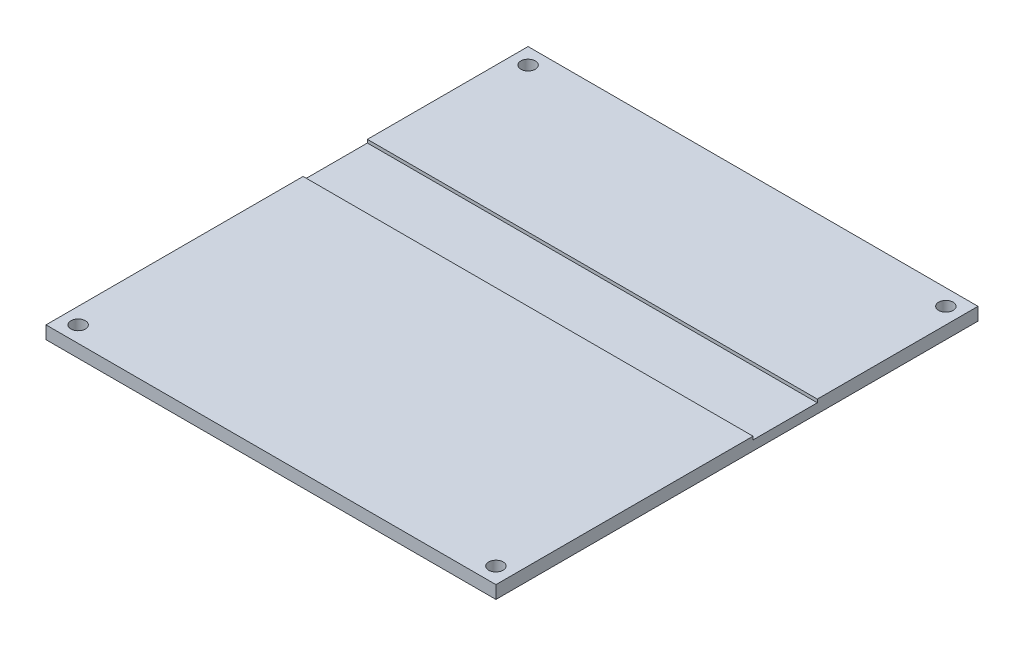
ISO-10303-21;
HEADER;
FILE_DESCRIPTION(('STEP AP214'),'2;1');
FILE_NAME('part.step','',(''),(''),'','','');
FILE_SCHEMA(('AUTOMOTIVE_DESIGN { 1 0 10303 214 1 1 1 1 }'));
ENDSEC;
DATA;
#1=APPLICATION_CONTEXT('core data for automotive mechanical design processes');
#2=APPLICATION_PROTOCOL_DEFINITION('international standard','automotive_design',2000,#1);
#3=PRODUCT_CONTEXT('',#1,'mechanical');
#4=PRODUCT('Part','Part','',(#3));
#5=PRODUCT_RELATED_PRODUCT_CATEGORY('part','',(#4));
#6=PRODUCT_DEFINITION_FORMATION('','',#4);
#7=PRODUCT_DEFINITION_CONTEXT('part definition',#1,'design');
#8=PRODUCT_DEFINITION('design','',#6,#7);
#9=PRODUCT_DEFINITION_SHAPE('','',#8);
#10=(LENGTH_UNIT() NAMED_UNIT(*) SI_UNIT(.MILLI.,.METRE.));
#11=(NAMED_UNIT(*) PLANE_ANGLE_UNIT() SI_UNIT($,.RADIAN.));
#12=(NAMED_UNIT(*) SI_UNIT($,.STERADIAN.) SOLID_ANGLE_UNIT());
#13=UNCERTAINTY_MEASURE_WITH_UNIT(LENGTH_MEASURE(1.E-05),#10,'distance_accuracy_value','');
#14=(GEOMETRIC_REPRESENTATION_CONTEXT(3) GLOBAL_UNCERTAINTY_ASSIGNED_CONTEXT((#13)) GLOBAL_UNIT_ASSIGNED_CONTEXT((#10,
#11,#12)) REPRESENTATION_CONTEXT('',''));
#15=CARTESIAN_POINT('',(0.,0.,0.));
#16=DIRECTION('',(0.,0.,1.));
#17=DIRECTION('',(1.,0.,0.));
#18=AXIS2_PLACEMENT_3D('',#15,#16,#17);
#19=CARTESIAN_POINT('',(0.,4.,0.));
#20=DIRECTION('',(0.,-1.,0.));
#21=DIRECTION('',(0.,0.,-1.));
#22=AXIS2_PLACEMENT_3D('',#19,#20,#21);
#23=PLANE('',#22);
#24=CARTESIAN_POINT('',(-65.,4.,-70.));
#25=DIRECTION('',(0.,1.,0.));
#26=DIRECTION('',(0.,0.,1.));
#27=AXIS2_PLACEMENT_3D('',#24,#25,#26);
#28=CIRCLE('',#27,2.24999999999999);
#29=CARTESIAN_POINT('',(-65.,4.,-67.75));
#30=VERTEX_POINT('',#29);
#31=EDGE_CURVE('E148',#30,#30,#28,.T.);
#32=ORIENTED_EDGE('',*,*,#31,.F.);
#33=EDGE_LOOP('',(#32));
#34=FACE_BOUND('',#33,.T.);
#35=CARTESIAN_POINT('',(65.,4.,-70.));
#36=DIRECTION('',(0.,1.,0.));
#37=DIRECTION('',(0.,0.,1.));
#38=AXIS2_PLACEMENT_3D('',#35,#36,#37);
#39=CIRCLE('',#38,2.24999999999999);
#40=CARTESIAN_POINT('',(65.,4.,-67.75));
#41=VERTEX_POINT('',#40);
#42=EDGE_CURVE('E167',#41,#41,#39,.T.);
#43=ORIENTED_EDGE('',*,*,#42,.F.);
#44=EDGE_LOOP('',(#43));
#45=FACE_BOUND('',#44,.T.);
#46=DIRECTION('',(0.,0.,1.));
#47=VECTOR('',#46,1.);
#48=CARTESIAN_POINT('',(-70.,4.,75.));
#49=LINE('',#48,#47);
#50=CARTESIAN_POINT('',(-70.,4.,-75.));
#51=VERTEX_POINT('',#50);
#52=CARTESIAN_POINT('',(-70.,4.,-25.));
#53=VERTEX_POINT('',#52);
#54=EDGE_CURVE('E178',#51,#53,#49,.T.);
#55=ORIENTED_EDGE('',*,*,#54,.T.);
#56=DIRECTION('',(-1.,0.,0.));
#57=VECTOR('',#56,1.);
#58=CARTESIAN_POINT('',(-70.,4.,-25.));
#59=LINE('',#58,#57);
#60=CARTESIAN_POINT('',(70.,4.,-25.));
#61=VERTEX_POINT('',#60);
#62=EDGE_CURVE('E136',#61,#53,#59,.T.);
#63=ORIENTED_EDGE('',*,*,#62,.F.);
#64=DIRECTION('',(0.,0.,-1.));
#65=VECTOR('',#64,1.);
#66=CARTESIAN_POINT('',(70.,4.,75.));
#67=LINE('',#66,#65);
#68=CARTESIAN_POINT('',(70.,4.,-75.));
#69=VERTEX_POINT('',#68);
#70=EDGE_CURVE('E98',#61,#69,#67,.T.);
#71=ORIENTED_EDGE('',*,*,#70,.T.);
#72=DIRECTION('',(-1.,0.,0.));
#73=VECTOR('',#72,1.);
#74=CARTESIAN_POINT('',(-70.,4.,-75.));
#75=LINE('',#74,#73);
#76=EDGE_CURVE('E176',#69,#51,#75,.T.);
#77=ORIENTED_EDGE('',*,*,#76,.T.);
#78=EDGE_LOOP('',(#55,#63,#71,#77));
#79=FACE_BOUND('',#78,.T.);
#80=ADVANCED_FACE('F45',(#34,#45,#79),#23,.F.);
#81=CARTESIAN_POINT('',(-65.,4.,70.));
#82=DIRECTION('',(0.,1.,0.));
#83=DIRECTION('',(0.,0.,1.));
#84=AXIS2_PLACEMENT_3D('',#81,#82,#83);
#85=CIRCLE('',#84,2.24999999999999);
#86=CARTESIAN_POINT('',(-65.,4.,72.25));
#87=VERTEX_POINT('',#86);
#88=EDGE_CURVE('E161',#87,#87,#85,.T.);
#89=ORIENTED_EDGE('',*,*,#88,.F.);
#90=EDGE_LOOP('',(#89));
#91=FACE_BOUND('',#90,.T.);
#92=CARTESIAN_POINT('',(70.,4.,75.));
#93=VERTEX_POINT('',#92);
#94=CARTESIAN_POINT('',(70.,4.,-4.99999999999999));
#95=VERTEX_POINT('',#94);
#96=EDGE_CURVE('E174',#93,#95,#67,.T.);
#97=ORIENTED_EDGE('',*,*,#96,.T.);
#98=DIRECTION('',(1.,0.,0.));
#99=VECTOR('',#98,1.);
#100=CARTESIAN_POINT('',(-70.,4.,-4.99999999999999));
#101=LINE('',#100,#99);
#102=CARTESIAN_POINT('',(-70.,4.,-4.99999999999999));
#103=VERTEX_POINT('',#102);
#104=EDGE_CURVE('E330',#103,#95,#101,.T.);
#105=ORIENTED_EDGE('',*,*,#104,.F.);
#106=CARTESIAN_POINT('',(-70.,4.,75.));
#107=VERTEX_POINT('',#106);
#108=EDGE_CURVE('E141',#103,#107,#49,.T.);
#109=ORIENTED_EDGE('',*,*,#108,.T.);
#110=DIRECTION('',(1.,0.,0.));
#111=VECTOR('',#110,1.);
#112=CARTESIAN_POINT('',(-70.,4.,75.));
#113=LINE('',#112,#111);
#114=EDGE_CURVE('E69',#107,#93,#113,.T.);
#115=ORIENTED_EDGE('',*,*,#114,.T.);
#116=EDGE_LOOP('',(#97,#105,#109,#115));
#117=FACE_BOUND('',#116,.T.);
#118=CARTESIAN_POINT('',(65.,4.,70.));
#119=DIRECTION('',(0.,1.,0.));
#120=DIRECTION('',(0.,0.,1.));
#121=AXIS2_PLACEMENT_3D('',#118,#119,#120);
#122=CIRCLE('',#121,2.24999999999999);
#123=CARTESIAN_POINT('',(65.,4.,72.25));
#124=VERTEX_POINT('',#123);
#125=EDGE_CURVE('E155',#124,#124,#122,.T.);
#126=ORIENTED_EDGE('',*,*,#125,.F.);
#127=EDGE_LOOP('',(#126));
#128=FACE_BOUND('',#127,.T.);
#129=ADVANCED_FACE('F217',(#91,#117,#128),#23,.F.);
#130=CARTESIAN_POINT('',(70.,4.,75.));
#131=DIRECTION('',(-1.,0.,0.));
#132=DIRECTION('',(0.,0.,1.));
#133=AXIS2_PLACEMENT_3D('',#130,#131,#132);
#134=PLANE('',#133);
#135=ORIENTED_EDGE('',*,*,#70,.F.);
#136=DIRECTION('',(0.,1.,0.));
#137=VECTOR('',#136,1.);
#138=CARTESIAN_POINT('',(70.,3.,-25.));
#139=LINE('',#138,#137);
#140=CARTESIAN_POINT('',(70.,3.,-25.));
#141=VERTEX_POINT('',#140);
#142=EDGE_CURVE('E143',#141,#61,#139,.T.);
#143=ORIENTED_EDGE('',*,*,#142,.F.);
#144=DIRECTION('',(0.,0.,-1.));
#145=VECTOR('',#144,1.);
#146=CARTESIAN_POINT('',(70.,3.,-4.99999999999999));
#147=LINE('',#146,#145);
#148=CARTESIAN_POINT('',(70.,3.,-4.99999999999999));
#149=VERTEX_POINT('',#148);
#150=EDGE_CURVE('E129',#149,#141,#147,.T.);
#151=ORIENTED_EDGE('',*,*,#150,.F.);
#152=DIRECTION('',(0.,1.,0.));
#153=VECTOR('',#152,1.);
#154=CARTESIAN_POINT('',(70.,3.,-4.99999999999999));
#155=LINE('',#154,#153);
#156=EDGE_CURVE('E127',#149,#95,#155,.T.);
#157=ORIENTED_EDGE('',*,*,#156,.T.);
#158=ORIENTED_EDGE('',*,*,#96,.F.);
#159=DIRECTION('',(0.,-1.,0.));
#160=VECTOR('',#159,1.);
#161=CARTESIAN_POINT('',(70.,4.,75.));
#162=LINE('',#161,#160);
#163=CARTESIAN_POINT('',(70.,0.,75.));
#164=VERTEX_POINT('',#163);
#165=EDGE_CURVE('E182',#93,#164,#162,.T.);
#166=ORIENTED_EDGE('',*,*,#165,.T.);
#167=DIRECTION('',(0.,0.,-1.));
#168=VECTOR('',#167,1.);
#169=CARTESIAN_POINT('',(70.,0.,75.));
#170=LINE('',#169,#168);
#171=CARTESIAN_POINT('',(70.,0.,-75.));
#172=VERTEX_POINT('',#171);
#173=EDGE_CURVE('E173',#164,#172,#170,.T.);
#174=ORIENTED_EDGE('',*,*,#173,.T.);
#175=DIRECTION('',(0.,-1.,0.));
#176=VECTOR('',#175,1.);
#177=CARTESIAN_POINT('',(70.,4.,-75.));
#178=LINE('',#177,#176);
#179=EDGE_CURVE('E11',#69,#172,#178,.T.);
#180=ORIENTED_EDGE('',*,*,#179,.F.);
#181=EDGE_LOOP('',(#135,#143,#151,#157,#158,#166,#174,#180));
#182=FACE_BOUND('',#181,.T.);
#183=ADVANCED_FACE('F47',(#182),#134,.F.);
#184=CARTESIAN_POINT('',(-70.,4.,-75.));
#185=DIRECTION('',(0.,0.,1.));
#186=DIRECTION('',(1.,0.,0.));
#187=AXIS2_PLACEMENT_3D('',#184,#185,#186);
#188=PLANE('',#187);
#189=DIRECTION('',(-1.,0.,0.));
#190=VECTOR('',#189,1.);
#191=CARTESIAN_POINT('',(-70.,0.,-75.));
#192=LINE('',#191,#190);
#193=CARTESIAN_POINT('',(-70.,0.,-75.));
#194=VERTEX_POINT('',#193);
#195=EDGE_CURVE('E185',#172,#194,#192,.T.);
#196=ORIENTED_EDGE('',*,*,#195,.T.);
#197=DIRECTION('',(0.,-1.,0.));
#198=VECTOR('',#197,1.);
#199=CARTESIAN_POINT('',(-70.,4.,-75.));
#200=LINE('',#199,#198);
#201=EDGE_CURVE('E53',#51,#194,#200,.T.);
#202=ORIENTED_EDGE('',*,*,#201,.F.);
#203=ORIENTED_EDGE('',*,*,#76,.F.);
#204=ORIENTED_EDGE('',*,*,#179,.T.);
#205=EDGE_LOOP('',(#196,#202,#203,#204));
#206=FACE_BOUND('',#205,.T.);
#207=ADVANCED_FACE('F214',(#206),#188,.F.);
#208=CARTESIAN_POINT('',(-70.,4.,75.));
#209=DIRECTION('',(1.,0.,0.));
#210=DIRECTION('',(0.,0.,-1.));
#211=AXIS2_PLACEMENT_3D('',#208,#209,#210);
#212=PLANE('',#211);
#213=DIRECTION('',(0.,0.,1.));
#214=VECTOR('',#213,1.);
#215=CARTESIAN_POINT('',(-70.,3.,-4.99999999999999));
#216=LINE('',#215,#214);
#217=CARTESIAN_POINT('',(-70.,3.,-25.));
#218=VERTEX_POINT('',#217);
#219=CARTESIAN_POINT('',(-70.,3.,-4.99999999999999));
#220=VERTEX_POINT('',#219);
#221=EDGE_CURVE('E130',#218,#220,#216,.T.);
#222=ORIENTED_EDGE('',*,*,#221,.F.);
#223=DIRECTION('',(0.,1.,0.));
#224=VECTOR('',#223,1.);
#225=CARTESIAN_POINT('',(-70.,3.,-25.));
#226=LINE('',#225,#224);
#227=EDGE_CURVE('E152',#218,#53,#226,.T.);
#228=ORIENTED_EDGE('',*,*,#227,.T.);
#229=ORIENTED_EDGE('',*,*,#54,.F.);
#230=ORIENTED_EDGE('',*,*,#201,.T.);
#231=DIRECTION('',(0.,0.,1.));
#232=VECTOR('',#231,1.);
#233=CARTESIAN_POINT('',(-70.,0.,75.));
#234=LINE('',#233,#232);
#235=CARTESIAN_POINT('',(-70.,0.,75.));
#236=VERTEX_POINT('',#235);
#237=EDGE_CURVE('E187',#194,#236,#234,.T.);
#238=ORIENTED_EDGE('',*,*,#237,.T.);
#239=DIRECTION('',(0.,-1.,0.));
#240=VECTOR('',#239,1.);
#241=CARTESIAN_POINT('',(-70.,4.,75.));
#242=LINE('',#241,#240);
#243=EDGE_CURVE('E191',#107,#236,#242,.T.);
#244=ORIENTED_EDGE('',*,*,#243,.F.);
#245=ORIENTED_EDGE('',*,*,#108,.F.);
#246=DIRECTION('',(0.,1.,0.));
#247=VECTOR('',#246,1.);
#248=CARTESIAN_POINT('',(-70.,3.,-4.99999999999999));
#249=LINE('',#248,#247);
#250=EDGE_CURVE('E124',#220,#103,#249,.T.);
#251=ORIENTED_EDGE('',*,*,#250,.F.);
#252=EDGE_LOOP('',(#222,#228,#229,#230,#238,#244,#245,#251));
#253=FACE_BOUND('',#252,.T.);
#254=ADVANCED_FACE('F139',(#253),#212,.F.);
#255=CARTESIAN_POINT('',(-70.,4.,75.));
#256=DIRECTION('',(0.,0.,-1.));
#257=DIRECTION('',(-1.,0.,0.));
#258=AXIS2_PLACEMENT_3D('',#255,#256,#257);
#259=PLANE('',#258);
#260=DIRECTION('',(1.,0.,0.));
#261=VECTOR('',#260,1.);
#262=CARTESIAN_POINT('',(-70.,0.,75.));
#263=LINE('',#262,#261);
#264=EDGE_CURVE('E90',#236,#164,#263,.T.);
#265=ORIENTED_EDGE('',*,*,#264,.T.);
#266=ORIENTED_EDGE('',*,*,#165,.F.);
#267=ORIENTED_EDGE('',*,*,#114,.F.);
#268=ORIENTED_EDGE('',*,*,#243,.T.);
#269=EDGE_LOOP('',(#265,#266,#267,#268));
#270=FACE_BOUND('',#269,.T.);
#271=ADVANCED_FACE('F203',(#270),#259,.F.);
#272=CARTESIAN_POINT('',(0.,0.,0.));
#273=DIRECTION('',(0.,-1.,0.));
#274=DIRECTION('',(0.,0.,-1.));
#275=AXIS2_PLACEMENT_3D('',#272,#273,#274);
#276=PLANE('',#275);
#277=CARTESIAN_POINT('',(-65.,0.,-70.));
#278=DIRECTION('',(0.,-1.,0.));
#279=DIRECTION('',(0.,0.,-1.));
#280=AXIS2_PLACEMENT_3D('',#277,#278,#279);
#281=CIRCLE('',#280,2.25);
#282=CARTESIAN_POINT('',(-65.,0.,-72.25));
#283=VERTEX_POINT('',#282);
#284=EDGE_CURVE('E151',#283,#283,#281,.T.);
#285=ORIENTED_EDGE('',*,*,#284,.F.);
#286=EDGE_LOOP('',(#285));
#287=FACE_BOUND('',#286,.T.);
#288=CARTESIAN_POINT('',(65.,0.,70.));
#289=DIRECTION('',(0.,-1.,0.));
#290=DIRECTION('',(0.,0.,-1.));
#291=AXIS2_PLACEMENT_3D('',#288,#289,#290);
#292=CIRCLE('',#291,2.25);
#293=CARTESIAN_POINT('',(65.,0.,67.75));
#294=VERTEX_POINT('',#293);
#295=EDGE_CURVE('E158',#294,#294,#292,.T.);
#296=ORIENTED_EDGE('',*,*,#295,.F.);
#297=EDGE_LOOP('',(#296));
#298=FACE_BOUND('',#297,.T.);
#299=CARTESIAN_POINT('',(-65.,0.,70.));
#300=DIRECTION('',(0.,-1.,0.));
#301=DIRECTION('',(0.,0.,-1.));
#302=AXIS2_PLACEMENT_3D('',#299,#300,#301);
#303=CIRCLE('',#302,2.25);
#304=CARTESIAN_POINT('',(-65.,0.,67.75));
#305=VERTEX_POINT('',#304);
#306=EDGE_CURVE('E164',#305,#305,#303,.T.);
#307=ORIENTED_EDGE('',*,*,#306,.F.);
#308=EDGE_LOOP('',(#307));
#309=FACE_BOUND('',#308,.T.);
#310=CARTESIAN_POINT('',(65.,0.,-70.));
#311=DIRECTION('',(0.,-1.,0.));
#312=DIRECTION('',(0.,0.,-1.));
#313=AXIS2_PLACEMENT_3D('',#310,#311,#312);
#314=CIRCLE('',#313,2.25);
#315=CARTESIAN_POINT('',(65.,0.,-72.25));
#316=VERTEX_POINT('',#315);
#317=EDGE_CURVE('E170',#316,#316,#314,.T.);
#318=ORIENTED_EDGE('',*,*,#317,.F.);
#319=EDGE_LOOP('',(#318));
#320=FACE_BOUND('',#319,.T.);
#321=ORIENTED_EDGE('',*,*,#173,.F.);
#322=ORIENTED_EDGE('',*,*,#264,.F.);
#323=ORIENTED_EDGE('',*,*,#237,.F.);
#324=ORIENTED_EDGE('',*,*,#195,.F.);
#325=EDGE_LOOP('',(#321,#322,#323,#324));
#326=FACE_BOUND('',#325,.T.);
#327=ADVANCED_FACE('F199',(#287,#298,#309,#320,#326),#276,.T.);
#328=CARTESIAN_POINT('',(65.,4.,-70.));
#329=DIRECTION('',(0.,1.,0.));
#330=DIRECTION('',(0.,0.,1.));
#331=AXIS2_PLACEMENT_3D('',#328,#329,#330);
#332=CYLINDRICAL_SURFACE('',#331,2.25);
#333=ORIENTED_EDGE('',*,*,#42,.T.);
#334=EDGE_LOOP('',(#333));
#335=FACE_BOUND('',#334,.T.);
#336=ORIENTED_EDGE('',*,*,#317,.T.);
#337=EDGE_LOOP('',(#336));
#338=FACE_BOUND('',#337,.T.);
#339=ADVANCED_FACE('F210',(#335,#338),#332,.F.);
#340=CARTESIAN_POINT('',(-65.,4.,70.));
#341=DIRECTION('',(0.,1.,0.));
#342=DIRECTION('',(0.,0.,1.));
#343=AXIS2_PLACEMENT_3D('',#340,#341,#342);
#344=CYLINDRICAL_SURFACE('',#343,2.25);
#345=ORIENTED_EDGE('',*,*,#88,.T.);
#346=EDGE_LOOP('',(#345));
#347=FACE_BOUND('',#346,.T.);
#348=ORIENTED_EDGE('',*,*,#306,.T.);
#349=EDGE_LOOP('',(#348));
#350=FACE_BOUND('',#349,.T.);
#351=ADVANCED_FACE('F230',(#347,#350),#344,.F.);
#352=CARTESIAN_POINT('',(65.,4.,70.));
#353=DIRECTION('',(0.,1.,0.));
#354=DIRECTION('',(0.,0.,1.));
#355=AXIS2_PLACEMENT_3D('',#352,#353,#354);
#356=CYLINDRICAL_SURFACE('',#355,2.25);
#357=ORIENTED_EDGE('',*,*,#125,.T.);
#358=EDGE_LOOP('',(#357));
#359=FACE_BOUND('',#358,.T.);
#360=ORIENTED_EDGE('',*,*,#295,.T.);
#361=EDGE_LOOP('',(#360));
#362=FACE_BOUND('',#361,.T.);
#363=ADVANCED_FACE('F234',(#359,#362),#356,.F.);
#364=CARTESIAN_POINT('',(-65.,4.,-70.));
#365=DIRECTION('',(0.,1.,0.));
#366=DIRECTION('',(0.,0.,1.));
#367=AXIS2_PLACEMENT_3D('',#364,#365,#366);
#368=CYLINDRICAL_SURFACE('',#367,2.25);
#369=ORIENTED_EDGE('',*,*,#31,.T.);
#370=EDGE_LOOP('',(#369));
#371=FACE_BOUND('',#370,.T.);
#372=ORIENTED_EDGE('',*,*,#284,.T.);
#373=EDGE_LOOP('',(#372));
#374=FACE_BOUND('',#373,.T.);
#375=ADVANCED_FACE('F238',(#371,#374),#368,.F.);
#376=CARTESIAN_POINT('',(-70.,3.,-25.));
#377=DIRECTION('',(0.,0.,-1.));
#378=DIRECTION('',(-1.,0.,0.));
#379=AXIS2_PLACEMENT_3D('',#376,#377,#378);
#380=PLANE('',#379);
#381=ORIENTED_EDGE('',*,*,#62,.T.);
#382=ORIENTED_EDGE('',*,*,#227,.F.);
#383=DIRECTION('',(-1.,0.,0.));
#384=VECTOR('',#383,1.);
#385=CARTESIAN_POINT('',(-70.,3.,-25.));
#386=LINE('',#385,#384);
#387=EDGE_CURVE('E60',#141,#218,#386,.T.);
#388=ORIENTED_EDGE('',*,*,#387,.F.);
#389=ORIENTED_EDGE('',*,*,#142,.T.);
#390=EDGE_LOOP('',(#381,#382,#388,#389));
#391=FACE_BOUND('',#390,.T.);
#392=ADVANCED_FACE('F241',(#391),#380,.F.);
#393=CARTESIAN_POINT('',(-70.,3.,-4.99999999999999));
#394=DIRECTION('',(0.,0.,1.));
#395=DIRECTION('',(1.,0.,0.));
#396=AXIS2_PLACEMENT_3D('',#393,#394,#395);
#397=PLANE('',#396);
#398=ORIENTED_EDGE('',*,*,#104,.T.);
#399=ORIENTED_EDGE('',*,*,#156,.F.);
#400=DIRECTION('',(1.,0.,0.));
#401=VECTOR('',#400,1.);
#402=CARTESIAN_POINT('',(-70.,3.,-4.99999999999999));
#403=LINE('',#402,#401);
#404=EDGE_CURVE('E121',#220,#149,#403,.T.);
#405=ORIENTED_EDGE('',*,*,#404,.F.);
#406=ORIENTED_EDGE('',*,*,#250,.T.);
#407=EDGE_LOOP('',(#398,#399,#405,#406));
#408=FACE_BOUND('',#407,.T.);
#409=ADVANCED_FACE('F122',(#408),#397,.F.);
#410=CARTESIAN_POINT('',(0.,3.,0.));
#411=DIRECTION('',(0.,-1.,0.));
#412=DIRECTION('',(0.,0.,-1.));
#413=AXIS2_PLACEMENT_3D('',#410,#411,#412);
#414=PLANE('',#413);
#415=ORIENTED_EDGE('',*,*,#221,.T.);
#416=ORIENTED_EDGE('',*,*,#404,.T.);
#417=ORIENTED_EDGE('',*,*,#150,.T.);
#418=ORIENTED_EDGE('',*,*,#387,.T.);
#419=EDGE_LOOP('',(#415,#416,#417,#418));
#420=FACE_BOUND('',#419,.T.);
#421=ADVANCED_FACE('F133',(#420),#414,.F.);
#422=CLOSED_SHELL('',(#80,#129,#183,#207,#254,#271,#327,#339,#351,#363,#375,#392,#409,#421));
#423=MANIFOLD_SOLID_BREP('B2',#422);
#424=ADVANCED_BREP_SHAPE_REPRESENTATION('',(#18,#423),#14);
#425=SHAPE_DEFINITION_REPRESENTATION(#9,#424);
ENDSEC;
END-ISO-10303-21;
